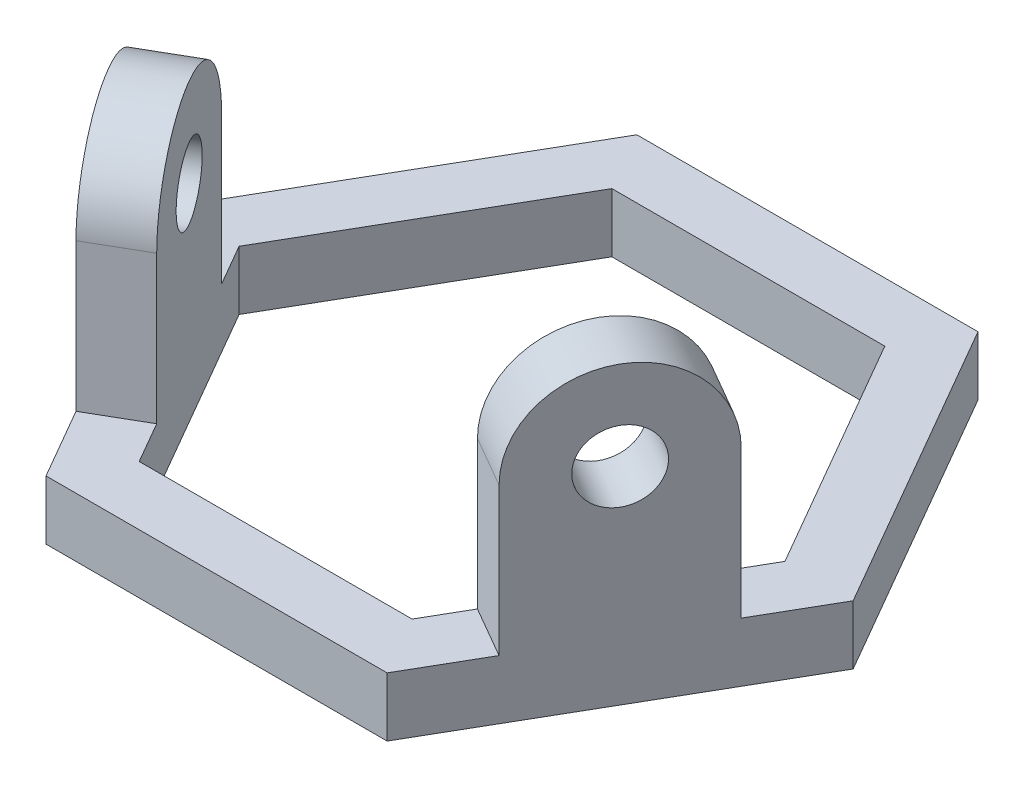
ISO-10303-21;
HEADER;
FILE_DESCRIPTION(('STEP AP214'),'2;1');
FILE_NAME('part.step','',(''),(''),'','','');
FILE_SCHEMA(('AUTOMOTIVE_DESIGN { 1 0 10303 214 1 1 1 1 }'));
ENDSEC;
DATA;
#1=APPLICATION_CONTEXT('core data for automotive mechanical design processes');
#2=APPLICATION_PROTOCOL_DEFINITION('international standard','automotive_design',2000,#1);
#3=PRODUCT_CONTEXT('',#1,'mechanical');
#4=PRODUCT('Part','Part','',(#3));
#5=PRODUCT_RELATED_PRODUCT_CATEGORY('part','',(#4));
#6=PRODUCT_DEFINITION_FORMATION('','',#4);
#7=PRODUCT_DEFINITION_CONTEXT('part definition',#1,'design');
#8=PRODUCT_DEFINITION('design','',#6,#7);
#9=PRODUCT_DEFINITION_SHAPE('','',#8);
#10=(LENGTH_UNIT() NAMED_UNIT(*) SI_UNIT(.MILLI.,.METRE.));
#11=(NAMED_UNIT(*) PLANE_ANGLE_UNIT() SI_UNIT($,.RADIAN.));
#12=(NAMED_UNIT(*) SI_UNIT($,.STERADIAN.) SOLID_ANGLE_UNIT());
#13=UNCERTAINTY_MEASURE_WITH_UNIT(LENGTH_MEASURE(1.E-05),#10,'distance_accuracy_value','');
#14=(GEOMETRIC_REPRESENTATION_CONTEXT(3) GLOBAL_UNCERTAINTY_ASSIGNED_CONTEXT((#13)) GLOBAL_UNIT_ASSIGNED_CONTEXT((#10,
#11,#12)) REPRESENTATION_CONTEXT('',''));
#15=CARTESIAN_POINT('',(0.,0.,0.));
#16=DIRECTION('',(0.,0.,1.));
#17=DIRECTION('',(1.,0.,0.));
#18=AXIS2_PLACEMENT_3D('',#15,#16,#17);
#19=CARTESIAN_POINT('',(0.,10.,0.));
#20=DIRECTION('',(0.,1.,0.));
#21=DIRECTION('',(0.,0.,1.));
#22=AXIS2_PLACEMENT_3D('',#19,#20,#21);
#23=PLANE('',#22);
#24=DIRECTION('',(0.5,0.,0.866025403784439));
#25=VECTOR('',#24,1.);
#26=CARTESIAN_POINT('',(-46.1880215351703,10.,0.));
#27=LINE('',#26,#25);
#28=CARTESIAN_POINT('',(-27.1410161513779,10.,32.9903810567665));
#29=VERTEX_POINT('',#28);
#30=CARTESIAN_POINT('',(-23.0940107675851,10.,40.0000000000003));
#31=VERTEX_POINT('',#30);
#32=EDGE_CURVE('E256',#29,#31,#27,.T.);
#33=ORIENTED_EDGE('',*,*,#32,.F.);
#34=DIRECTION('',(-0.866025403784442,0.,0.499999999999995));
#35=VECTOR('',#34,1.);
#36=CARTESIAN_POINT('',(-27.1410161513779,10.,32.9903810567665));
#37=LINE('',#36,#35);
#38=CARTESIAN_POINT('',(-35.801270189222,10.,37.9903810567663));
#39=VERTEX_POINT('',#38);
#40=EDGE_CURVE('E218',#29,#39,#37,.T.);
#41=ORIENTED_EDGE('',*,*,#40,.T.);
#42=DIRECTION('',(0.500000000000007,0.,0.866025403784434));
#43=VECTOR('',#42,1.);
#44=CARTESIAN_POINT('',(-57.7350269189626,10.,4.03161538170328E-13));
#45=LINE('',#44,#43);
#46=CARTESIAN_POINT('',(-28.8675134594808,10.,50.0000000000003));
#47=VERTEX_POINT('',#46);
#48=EDGE_CURVE('E306',#39,#47,#45,.T.);
#49=ORIENTED_EDGE('',*,*,#48,.T.);
#50=DIRECTION('',(1.,0.,0.));
#51=VECTOR('',#50,1.);
#52=CARTESIAN_POINT('',(-28.8675134594808,10.,50.0000000000003));
#53=LINE('',#52,#51);
#54=CARTESIAN_POINT('',(28.8675134594819,10.,49.9999999999997));
#55=VERTEX_POINT('',#54);
#56=EDGE_CURVE('E315',#47,#55,#53,.T.);
#57=ORIENTED_EDGE('',*,*,#56,.T.);
#58=DIRECTION('',(0.499999999999995,0.,-0.866025403784441));
#59=VECTOR('',#58,1.);
#60=CARTESIAN_POINT('',(28.8675134594819,10.,49.9999999999997));
#61=LINE('',#60,#59);
#62=CARTESIAN_POINT('',(35.8012701892223,10.,37.9903810567665));
#63=VERTEX_POINT('',#62);
#64=EDGE_CURVE('E297',#55,#63,#61,.T.);
#65=ORIENTED_EDGE('',*,*,#64,.T.);
#66=DIRECTION('',(0.866025403784442,0.,0.499999999999995));
#67=VECTOR('',#66,1.);
#68=CARTESIAN_POINT('',(27.1410161513779,10.,32.9903810567665));
#69=LINE('',#68,#67);
#70=CARTESIAN_POINT('',(27.1410161513779,10.,32.9903810567665));
#71=VERTEX_POINT('',#70);
#72=EDGE_CURVE('E248',#71,#63,#69,.T.);
#73=ORIENTED_EDGE('',*,*,#72,.F.);
#74=DIRECTION('',(0.5,0.,-0.866025403784439));
#75=VECTOR('',#74,1.);
#76=CARTESIAN_POINT('',(23.0940107675853,10.,40.0000000000003));
#77=LINE('',#76,#75);
#78=CARTESIAN_POINT('',(23.0940107675853,10.,40.0000000000003));
#79=VERTEX_POINT('',#78);
#80=EDGE_CURVE('E262',#79,#71,#77,.T.);
#81=ORIENTED_EDGE('',*,*,#80,.F.);
#82=DIRECTION('',(1.,0.,0.));
#83=VECTOR('',#82,1.);
#84=CARTESIAN_POINT('',(-23.0940107675851,10.,40.0000000000003));
#85=LINE('',#84,#83);
#86=EDGE_CURVE('E257',#31,#79,#85,.T.);
#87=ORIENTED_EDGE('',*,*,#86,.F.);
#88=EDGE_LOOP('',(#33,#41,#49,#57,#65,#73,#81,#87));
#89=FACE_BOUND('',#88,.T.);
#90=ADVANCED_FACE('F41',(#89),#23,.T.);
#91=DIRECTION('',(-0.866025403784442,0.,0.499999999999995));
#92=VECTOR('',#91,1.);
#93=CARTESIAN_POINT('',(-42.1410161513778,10.,7.00961894323329));
#94=LINE('',#93,#92);
#95=CARTESIAN_POINT('',(-42.1410161513778,10.,7.00961894323329));
#96=VERTEX_POINT('',#95);
#97=CARTESIAN_POINT('',(-50.8012701892222,10.,12.0096189432332));
#98=VERTEX_POINT('',#97);
#99=EDGE_CURVE('E205',#96,#98,#94,.T.);
#100=ORIENTED_EDGE('',*,*,#99,.F.);
#101=CARTESIAN_POINT('',(-46.1880215351703,10.,0.));
#102=VERTEX_POINT('',#101);
#103=EDGE_CURVE('E190',#102,#96,#27,.T.);
#104=ORIENTED_EDGE('',*,*,#103,.F.);
#105=DIRECTION('',(-0.5,0.,0.866025403784439));
#106=VECTOR('',#105,1.);
#107=CARTESIAN_POINT('',(-23.0940107675852,10.,-40.0000000000001));
#108=LINE('',#107,#106);
#109=CARTESIAN_POINT('',(-23.0940107675852,10.,-40.0000000000001));
#110=VERTEX_POINT('',#109);
#111=EDGE_CURVE('E258',#110,#102,#108,.T.);
#112=ORIENTED_EDGE('',*,*,#111,.F.);
#113=DIRECTION('',(-1.,0.,0.));
#114=VECTOR('',#113,1.);
#115=CARTESIAN_POINT('',(23.094010767585,10.,-40.0000000000001));
#116=LINE('',#115,#114);
#117=CARTESIAN_POINT('',(23.094010767585,10.,-40.0000000000001));
#118=VERTEX_POINT('',#117);
#119=EDGE_CURVE('E251',#118,#110,#116,.T.);
#120=ORIENTED_EDGE('',*,*,#119,.F.);
#121=DIRECTION('',(-0.5,0.,-0.866025403784439));
#122=VECTOR('',#121,1.);
#123=CARTESIAN_POINT('',(46.1880215351703,10.,3.32199545649559E-13));
#124=LINE('',#123,#122);
#125=CARTESIAN_POINT('',(46.1880215351703,10.,3.32199545649559E-13));
#126=VERTEX_POINT('',#125);
#127=EDGE_CURVE('E253',#126,#118,#124,.T.);
#128=ORIENTED_EDGE('',*,*,#127,.F.);
#129=CARTESIAN_POINT('',(42.1410161513778,10.,7.00961894323329));
#130=VERTEX_POINT('',#129);
#131=EDGE_CURVE('E263',#130,#126,#77,.T.);
#132=ORIENTED_EDGE('',*,*,#131,.F.);
#133=DIRECTION('',(0.866025403784442,0.,0.499999999999995));
#134=VECTOR('',#133,1.);
#135=CARTESIAN_POINT('',(42.1410161513778,10.,7.00961894323329));
#136=LINE('',#135,#134);
#137=CARTESIAN_POINT('',(50.8012701892222,10.,12.0096189432332));
#138=VERTEX_POINT('',#137);
#139=EDGE_CURVE('E246',#130,#138,#136,.T.);
#140=ORIENTED_EDGE('',*,*,#139,.T.);
#141=CARTESIAN_POINT('',(57.7350269189626,10.,0.));
#142=VERTEX_POINT('',#141);
#143=EDGE_CURVE('E305',#138,#142,#61,.T.);
#144=ORIENTED_EDGE('',*,*,#143,.T.);
#145=DIRECTION('',(-0.500000000000001,0.,-0.866025403784438));
#146=VECTOR('',#145,1.);
#147=CARTESIAN_POINT('',(57.7350269189626,10.,0.));
#148=LINE('',#147,#146);
#149=CARTESIAN_POINT('',(28.8675134594812,10.,-50.0000000000001));
#150=VERTEX_POINT('',#149);
#151=EDGE_CURVE('E301',#142,#150,#148,.T.);
#152=ORIENTED_EDGE('',*,*,#151,.T.);
#153=DIRECTION('',(-1.,0.,0.));
#154=VECTOR('',#153,1.);
#155=CARTESIAN_POINT('',(28.8675134594812,10.,-50.0000000000001));
#156=LINE('',#155,#154);
#157=CARTESIAN_POINT('',(-28.8675134594815,10.,-49.9999999999999));
#158=VERTEX_POINT('',#157);
#159=EDGE_CURVE('E302',#150,#158,#156,.T.);
#160=ORIENTED_EDGE('',*,*,#159,.T.);
#161=DIRECTION('',(-0.499999999999995,0.,0.866025403784442));
#162=VECTOR('',#161,1.);
#163=CARTESIAN_POINT('',(-28.8675134594815,10.,-49.9999999999999));
#164=LINE('',#163,#162);
#165=CARTESIAN_POINT('',(-57.7350269189626,10.,4.03161538170328E-13));
#166=VERTEX_POINT('',#165);
#167=EDGE_CURVE('E308',#158,#166,#164,.T.);
#168=ORIENTED_EDGE('',*,*,#167,.T.);
#169=EDGE_CURVE('E310',#166,#98,#45,.T.);
#170=ORIENTED_EDGE('',*,*,#169,.T.);
#171=EDGE_LOOP('',(#100,#104,#112,#120,#128,#132,#140,#144,#152,#160,#168,#170));
#172=FACE_BOUND('',#171,.T.);
#173=ADVANCED_FACE('F361',(#172),#23,.T.);
#174=CARTESIAN_POINT('',(0.,0.,0.));
#175=DIRECTION('',(0.,1.,0.));
#176=DIRECTION('',(0.,0.,1.));
#177=AXIS2_PLACEMENT_3D('',#174,#175,#176);
#178=PLANE('',#177);
#179=DIRECTION('',(0.499999999999995,0.,-0.866025403784441));
#180=VECTOR('',#179,1.);
#181=CARTESIAN_POINT('',(28.8675134594819,0.,49.9999999999997));
#182=LINE('',#181,#180);
#183=CARTESIAN_POINT('',(28.8675134594819,0.,49.9999999999997));
#184=VERTEX_POINT('',#183);
#185=CARTESIAN_POINT('',(57.7350269189626,0.,0.));
#186=VERTEX_POINT('',#185);
#187=EDGE_CURVE('E299',#184,#186,#182,.T.);
#188=ORIENTED_EDGE('',*,*,#187,.F.);
#189=DIRECTION('',(1.,0.,0.));
#190=VECTOR('',#189,1.);
#191=CARTESIAN_POINT('',(-28.8675134594808,0.,50.0000000000003));
#192=LINE('',#191,#190);
#193=CARTESIAN_POINT('',(-28.8675134594808,0.,50.0000000000003));
#194=VERTEX_POINT('',#193);
#195=EDGE_CURVE('E324',#194,#184,#192,.T.);
#196=ORIENTED_EDGE('',*,*,#195,.F.);
#197=DIRECTION('',(0.500000000000007,0.,0.866025403784434));
#198=VECTOR('',#197,1.);
#199=CARTESIAN_POINT('',(-57.7350269189626,0.,4.03161538170328E-13));
#200=LINE('',#199,#198);
#201=CARTESIAN_POINT('',(-57.7350269189626,0.,4.03161538170328E-13));
#202=VERTEX_POINT('',#201);
#203=EDGE_CURVE('E323',#202,#194,#200,.T.);
#204=ORIENTED_EDGE('',*,*,#203,.F.);
#205=DIRECTION('',(-0.499999999999995,0.,0.866025403784442));
#206=VECTOR('',#205,1.);
#207=CARTESIAN_POINT('',(-28.8675134594815,0.,-49.9999999999999));
#208=LINE('',#207,#206);
#209=CARTESIAN_POINT('',(-28.8675134594815,0.,-49.9999999999999));
#210=VERTEX_POINT('',#209);
#211=EDGE_CURVE('E321',#210,#202,#208,.T.);
#212=ORIENTED_EDGE('',*,*,#211,.F.);
#213=DIRECTION('',(-1.,0.,0.));
#214=VECTOR('',#213,1.);
#215=CARTESIAN_POINT('',(28.8675134594812,0.,-50.0000000000001));
#216=LINE('',#215,#214);
#217=CARTESIAN_POINT('',(28.8675134594812,0.,-50.0000000000001));
#218=VERTEX_POINT('',#217);
#219=EDGE_CURVE('E317',#218,#210,#216,.T.);
#220=ORIENTED_EDGE('',*,*,#219,.F.);
#221=DIRECTION('',(-0.500000000000001,0.,-0.866025403784438));
#222=VECTOR('',#221,1.);
#223=CARTESIAN_POINT('',(57.7350269189626,0.,0.));
#224=LINE('',#223,#222);
#225=EDGE_CURVE('E320',#186,#218,#224,.T.);
#226=ORIENTED_EDGE('',*,*,#225,.F.);
#227=EDGE_LOOP('',(#188,#196,#204,#212,#220,#226));
#228=FACE_BOUND('',#227,.T.);
#229=DIRECTION('',(-0.5,0.,-0.866025403784439));
#230=VECTOR('',#229,1.);
#231=CARTESIAN_POINT('',(46.1880215351703,0.,3.32199545649559E-13));
#232=LINE('',#231,#230);
#233=CARTESIAN_POINT('',(46.1880215351703,0.,3.33066907387547E-13));
#234=VERTEX_POINT('',#233);
#235=CARTESIAN_POINT('',(23.094010767585,0.,-40.0000000000001));
#236=VERTEX_POINT('',#235);
#237=EDGE_CURVE('E241',#234,#236,#232,.T.);
#238=ORIENTED_EDGE('',*,*,#237,.T.);
#239=DIRECTION('',(-1.,0.,0.));
#240=VECTOR('',#239,1.);
#241=CARTESIAN_POINT('',(23.094010767585,0.,-40.0000000000001));
#242=LINE('',#241,#240);
#243=CARTESIAN_POINT('',(-23.0940107675852,0.,-40.0000000000001));
#244=VERTEX_POINT('',#243);
#245=EDGE_CURVE('E269',#236,#244,#242,.T.);
#246=ORIENTED_EDGE('',*,*,#245,.T.);
#247=DIRECTION('',(-0.5,0.,0.866025403784439));
#248=VECTOR('',#247,1.);
#249=CARTESIAN_POINT('',(-23.0940107675852,0.,-40.0000000000001));
#250=LINE('',#249,#248);
#251=CARTESIAN_POINT('',(-46.1880215351703,0.,0.));
#252=VERTEX_POINT('',#251);
#253=EDGE_CURVE('E272',#244,#252,#250,.T.);
#254=ORIENTED_EDGE('',*,*,#253,.T.);
#255=DIRECTION('',(0.5,0.,0.866025403784439));
#256=VECTOR('',#255,1.);
#257=CARTESIAN_POINT('',(-46.1880215351703,0.,0.));
#258=LINE('',#257,#256);
#259=CARTESIAN_POINT('',(-23.0940107675851,0.,40.0000000000003));
#260=VERTEX_POINT('',#259);
#261=EDGE_CURVE('E277',#252,#260,#258,.T.);
#262=ORIENTED_EDGE('',*,*,#261,.T.);
#263=DIRECTION('',(1.,0.,0.));
#264=VECTOR('',#263,1.);
#265=CARTESIAN_POINT('',(-23.0940107675851,0.,40.0000000000003));
#266=LINE('',#265,#264);
#267=CARTESIAN_POINT('',(23.0940107675853,0.,40.0000000000003));
#268=VERTEX_POINT('',#267);
#269=EDGE_CURVE('E276',#260,#268,#266,.T.);
#270=ORIENTED_EDGE('',*,*,#269,.T.);
#271=DIRECTION('',(0.5,0.,-0.866025403784439));
#272=VECTOR('',#271,1.);
#273=CARTESIAN_POINT('',(23.0940107675853,0.,40.0000000000003));
#274=LINE('',#273,#272);
#275=EDGE_CURVE('E255',#268,#234,#274,.T.);
#276=ORIENTED_EDGE('',*,*,#275,.T.);
#277=EDGE_LOOP('',(#238,#246,#254,#262,#270,#276));
#278=FACE_BOUND('',#277,.T.);
#279=ADVANCED_FACE('F349',(#228,#278),#178,.F.);
#280=CARTESIAN_POINT('',(28.8675134594819,10.,49.9999999999997));
#281=DIRECTION('',(-0.866025403784441,0.,-0.499999999999995));
#282=DIRECTION('',(-0.499999999999995,0.,0.866025403784441));
#283=AXIS2_PLACEMENT_3D('',#280,#281,#282);
#284=PLANE('',#283);
#285=ORIENTED_EDGE('',*,*,#187,.T.);
#286=DIRECTION('',(0.,-1.,0.));
#287=VECTOR('',#286,1.);
#288=CARTESIAN_POINT('',(57.7350269189626,10.,0.));
#289=LINE('',#288,#287);
#290=EDGE_CURVE('E11',#142,#186,#289,.T.);
#291=ORIENTED_EDGE('',*,*,#290,.F.);
#292=ORIENTED_EDGE('',*,*,#143,.F.);
#293=DIRECTION('',(0.,1.,0.));
#294=VECTOR('',#293,1.);
#295=CARTESIAN_POINT('',(50.8012701892222,35.,12.0096189432332));
#296=LINE('',#295,#294);
#297=CARTESIAN_POINT('',(50.8012701892222,35.,12.0096189432332));
#298=VERTEX_POINT('',#297);
#299=EDGE_CURVE('E65',#138,#298,#296,.T.);
#300=ORIENTED_EDGE('',*,*,#299,.T.);
#301=CARTESIAN_POINT('',(43.3012701892223,35.,24.9999999999999));
#302=DIRECTION('',(0.866025403784442,0.,0.499999999999995));
#303=DIRECTION('',(0.499999999999995,0.,-0.866025403784442));
#304=AXIS2_PLACEMENT_3D('',#301,#302,#303);
#305=CIRCLE('',#304,15.);
#306=CARTESIAN_POINT('',(35.8012701892223,35.,37.9903810567665));
#307=VERTEX_POINT('',#306);
#308=EDGE_CURVE('E223',#298,#307,#305,.T.);
#309=ORIENTED_EDGE('',*,*,#308,.T.);
#310=DIRECTION('',(0.,-1.,0.));
#311=VECTOR('',#310,1.);
#312=CARTESIAN_POINT('',(35.8012701892223,35.,37.9903810567665));
#313=LINE('',#312,#311);
#314=EDGE_CURVE('E239',#307,#63,#313,.T.);
#315=ORIENTED_EDGE('',*,*,#314,.T.);
#316=ORIENTED_EDGE('',*,*,#64,.F.);
#317=DIRECTION('',(0.,-1.,0.));
#318=VECTOR('',#317,1.);
#319=CARTESIAN_POINT('',(28.8675134594819,10.,49.9999999999997));
#320=LINE('',#319,#318);
#321=EDGE_CURVE('E314',#55,#184,#320,.T.);
#322=ORIENTED_EDGE('',*,*,#321,.T.);
#323=EDGE_LOOP('',(#285,#291,#292,#300,#309,#315,#316,#322));
#324=FACE_BOUND('',#323,.T.);
#325=CARTESIAN_POINT('',(43.3012701892223,35.,24.9999999999999));
#326=DIRECTION('',(0.866025403784442,0.,0.499999999999995));
#327=DIRECTION('',(0.499999999999995,0.,-0.866025403784442));
#328=AXIS2_PLACEMENT_3D('',#325,#326,#327);
#329=CIRCLE('',#328,6.);
#330=CARTESIAN_POINT('',(46.3012701892222,35.,19.8038475772932));
#331=VERTEX_POINT('',#330);
#332=EDGE_CURVE('E217',#331,#331,#329,.T.);
#333=ORIENTED_EDGE('',*,*,#332,.F.);
#334=EDGE_LOOP('',(#333));
#335=FACE_BOUND('',#334,.T.);
#336=ADVANCED_FACE('F43',(#324,#335),#284,.F.);
#337=CARTESIAN_POINT('',(57.7350269189626,10.,0.));
#338=DIRECTION('',(-0.866025403784438,0.,0.500000000000001));
#339=DIRECTION('',(0.500000000000001,0.,0.866025403784438));
#340=AXIS2_PLACEMENT_3D('',#337,#338,#339);
#341=PLANE('',#340);
#342=ORIENTED_EDGE('',*,*,#225,.T.);
#343=DIRECTION('',(0.,-1.,0.));
#344=VECTOR('',#343,1.);
#345=CARTESIAN_POINT('',(28.8675134594812,10.,-50.0000000000001));
#346=LINE('',#345,#344);
#347=EDGE_CURVE('E47',#150,#218,#346,.T.);
#348=ORIENTED_EDGE('',*,*,#347,.F.);
#349=ORIENTED_EDGE('',*,*,#151,.F.);
#350=ORIENTED_EDGE('',*,*,#290,.T.);
#351=EDGE_LOOP('',(#342,#348,#349,#350));
#352=FACE_BOUND('',#351,.T.);
#353=ADVANCED_FACE('F368',(#352),#341,.F.);
#354=CARTESIAN_POINT('',(28.8675134594812,10.,-50.0000000000001));
#355=DIRECTION('',(0.,0.,1.));
#356=DIRECTION('',(1.,0.,0.));
#357=AXIS2_PLACEMENT_3D('',#354,#355,#356);
#358=PLANE('',#357);
#359=ORIENTED_EDGE('',*,*,#219,.T.);
#360=DIRECTION('',(0.,-1.,0.));
#361=VECTOR('',#360,1.);
#362=CARTESIAN_POINT('',(-28.8675134594815,10.,-49.9999999999999));
#363=LINE('',#362,#361);
#364=EDGE_CURVE('E333',#158,#210,#363,.T.);
#365=ORIENTED_EDGE('',*,*,#364,.F.);
#366=ORIENTED_EDGE('',*,*,#159,.F.);
#367=ORIENTED_EDGE('',*,*,#347,.T.);
#368=EDGE_LOOP('',(#359,#365,#366,#367));
#369=FACE_BOUND('',#368,.T.);
#370=ADVANCED_FACE('F345',(#369),#358,.F.);
#371=CARTESIAN_POINT('',(-28.8675134594815,10.,-49.9999999999999));
#372=DIRECTION('',(0.866025403784442,0.,0.499999999999995));
#373=DIRECTION('',(0.499999999999995,0.,-0.866025403784442));
#374=AXIS2_PLACEMENT_3D('',#371,#372,#373);
#375=PLANE('',#374);
#376=ORIENTED_EDGE('',*,*,#211,.T.);
#377=DIRECTION('',(0.,-1.,0.));
#378=VECTOR('',#377,1.);
#379=CARTESIAN_POINT('',(-57.7350269189626,10.,4.03161538170328E-13));
#380=LINE('',#379,#378);
#381=EDGE_CURVE('E335',#166,#202,#380,.T.);
#382=ORIENTED_EDGE('',*,*,#381,.F.);
#383=ORIENTED_EDGE('',*,*,#167,.F.);
#384=ORIENTED_EDGE('',*,*,#364,.T.);
#385=EDGE_LOOP('',(#376,#382,#383,#384));
#386=FACE_BOUND('',#385,.T.);
#387=ADVANCED_FACE('F351',(#386),#375,.F.);
#388=CARTESIAN_POINT('',(-57.7350269189626,10.,4.03161538170328E-13));
#389=DIRECTION('',(0.866025403784435,0.,-0.500000000000007));
#390=DIRECTION('',(-0.500000000000007,0.,-0.866025403784435));
#391=AXIS2_PLACEMENT_3D('',#388,#389,#390);
#392=PLANE('',#391);
#393=ORIENTED_EDGE('',*,*,#203,.T.);
#394=DIRECTION('',(0.,-1.,0.));
#395=VECTOR('',#394,1.);
#396=CARTESIAN_POINT('',(-28.8675134594808,10.,50.0000000000003));
#397=LINE('',#396,#395);
#398=EDGE_CURVE('E328',#47,#194,#397,.T.);
#399=ORIENTED_EDGE('',*,*,#398,.F.);
#400=ORIENTED_EDGE('',*,*,#48,.F.);
#401=DIRECTION('',(0.,-1.,0.));
#402=VECTOR('',#401,1.);
#403=CARTESIAN_POINT('',(-35.8012701892223,35.,37.9903810567665));
#404=LINE('',#403,#402);
#405=CARTESIAN_POINT('',(-35.8012701892223,35.,37.9903810567665));
#406=VERTEX_POINT('',#405);
#407=EDGE_CURVE('E57',#406,#39,#404,.T.);
#408=ORIENTED_EDGE('',*,*,#407,.F.);
#409=CARTESIAN_POINT('',(-43.3012701892223,35.,24.9999999999999));
#410=DIRECTION('',(0.866025403784442,0.,-0.499999999999995));
#411=DIRECTION('',(-0.499999999999995,0.,-0.866025403784442));
#412=AXIS2_PLACEMENT_3D('',#409,#410,#411);
#413=CIRCLE('',#412,15.);
#414=CARTESIAN_POINT('',(-50.8012701892222,35.,12.0096189432332));
#415=VERTEX_POINT('',#414);
#416=EDGE_CURVE('E213',#415,#406,#413,.T.);
#417=ORIENTED_EDGE('',*,*,#416,.F.);
#418=DIRECTION('',(0.,1.,0.));
#419=VECTOR('',#418,1.);
#420=CARTESIAN_POINT('',(-50.8012701892222,35.,12.0096189432332));
#421=LINE('',#420,#419);
#422=EDGE_CURVE('E196',#98,#415,#421,.T.);
#423=ORIENTED_EDGE('',*,*,#422,.F.);
#424=ORIENTED_EDGE('',*,*,#169,.F.);
#425=ORIENTED_EDGE('',*,*,#381,.T.);
#426=EDGE_LOOP('',(#393,#399,#400,#408,#417,#423,#424,#425));
#427=FACE_BOUND('',#426,.T.);
#428=CARTESIAN_POINT('',(-43.3012701892223,35.,24.9999999999999));
#429=DIRECTION('',(0.866025403784442,0.,-0.499999999999995));
#430=DIRECTION('',(-0.499999999999995,0.,-0.866025403784442));
#431=AXIS2_PLACEMENT_3D('',#428,#429,#430);
#432=CIRCLE('',#431,6.);
#433=CARTESIAN_POINT('',(-46.3012701892222,35.,19.8038475772932));
#434=VERTEX_POINT('',#433);
#435=EDGE_CURVE('E207',#434,#434,#432,.T.);
#436=ORIENTED_EDGE('',*,*,#435,.T.);
#437=EDGE_LOOP('',(#436));
#438=FACE_BOUND('',#437,.T.);
#439=ADVANCED_FACE('F357',(#427,#438),#392,.F.);
#440=CARTESIAN_POINT('',(-28.8675134594808,10.,50.0000000000003));
#441=DIRECTION('',(0.,0.,-1.));
#442=DIRECTION('',(-1.,0.,0.));
#443=AXIS2_PLACEMENT_3D('',#440,#441,#442);
#444=PLANE('',#443);
#445=ORIENTED_EDGE('',*,*,#195,.T.);
#446=ORIENTED_EDGE('',*,*,#321,.F.);
#447=ORIENTED_EDGE('',*,*,#56,.F.);
#448=ORIENTED_EDGE('',*,*,#398,.T.);
#449=EDGE_LOOP('',(#445,#446,#447,#448));
#450=FACE_BOUND('',#449,.T.);
#451=ADVANCED_FACE('F375',(#450),#444,.F.);
#452=CARTESIAN_POINT('',(46.1880215351703,10.,3.32199545649559E-13));
#453=DIRECTION('',(-0.866025403784439,0.,0.5));
#454=DIRECTION('',(0.5,0.,0.866025403784439));
#455=AXIS2_PLACEMENT_3D('',#452,#453,#454);
#456=PLANE('',#455);
#457=ORIENTED_EDGE('',*,*,#237,.F.);
#458=DIRECTION('',(0.,-1.,0.));
#459=VECTOR('',#458,1.);
#460=CARTESIAN_POINT('',(46.1880215351703,10.,3.32199545649559E-13));
#461=LINE('',#460,#459);
#462=EDGE_CURVE('E270',#126,#234,#461,.T.);
#463=ORIENTED_EDGE('',*,*,#462,.F.);
#464=ORIENTED_EDGE('',*,*,#127,.T.);
#465=DIRECTION('',(0.,-1.,0.));
#466=VECTOR('',#465,1.);
#467=CARTESIAN_POINT('',(23.094010767585,10.,-40.0000000000001));
#468=LINE('',#467,#466);
#469=EDGE_CURVE('E294',#118,#236,#468,.T.);
#470=ORIENTED_EDGE('',*,*,#469,.T.);
#471=EDGE_LOOP('',(#457,#463,#464,#470));
#472=FACE_BOUND('',#471,.T.);
#473=ADVANCED_FACE('F401',(#472),#456,.T.);
#474=CARTESIAN_POINT('',(23.094010767585,10.,-40.0000000000001));
#475=DIRECTION('',(0.,0.,1.));
#476=DIRECTION('',(1.,0.,0.));
#477=AXIS2_PLACEMENT_3D('',#474,#475,#476);
#478=PLANE('',#477);
#479=ORIENTED_EDGE('',*,*,#245,.F.);
#480=ORIENTED_EDGE('',*,*,#469,.F.);
#481=ORIENTED_EDGE('',*,*,#119,.T.);
#482=DIRECTION('',(0.,-1.,0.));
#483=VECTOR('',#482,1.);
#484=CARTESIAN_POINT('',(-23.0940107675852,10.,-40.0000000000001));
#485=LINE('',#484,#483);
#486=EDGE_CURVE('E295',#110,#244,#485,.T.);
#487=ORIENTED_EDGE('',*,*,#486,.T.);
#488=EDGE_LOOP('',(#479,#480,#481,#487));
#489=FACE_BOUND('',#488,.T.);
#490=ADVANCED_FACE('F399',(#489),#478,.T.);
#491=CARTESIAN_POINT('',(-23.0940107675852,10.,-40.0000000000001));
#492=DIRECTION('',(0.866025403784439,0.,0.5));
#493=DIRECTION('',(0.5,0.,-0.866025403784439));
#494=AXIS2_PLACEMENT_3D('',#491,#492,#493);
#495=PLANE('',#494);
#496=ORIENTED_EDGE('',*,*,#253,.F.);
#497=ORIENTED_EDGE('',*,*,#486,.F.);
#498=ORIENTED_EDGE('',*,*,#111,.T.);
#499=DIRECTION('',(0.,-1.,0.));
#500=VECTOR('',#499,1.);
#501=CARTESIAN_POINT('',(-46.1880215351703,10.,0.));
#502=LINE('',#501,#500);
#503=EDGE_CURVE('E289',#102,#252,#502,.T.);
#504=ORIENTED_EDGE('',*,*,#503,.T.);
#505=EDGE_LOOP('',(#496,#497,#498,#504));
#506=FACE_BOUND('',#505,.T.);
#507=ADVANCED_FACE('F398',(#506),#495,.T.);
#508=CARTESIAN_POINT('',(-46.1880215351703,10.,0.));
#509=DIRECTION('',(0.866025403784439,0.,-0.5));
#510=DIRECTION('',(-0.5,0.,-0.866025403784439));
#511=AXIS2_PLACEMENT_3D('',#508,#509,#510);
#512=PLANE('',#511);
#513=ORIENTED_EDGE('',*,*,#261,.F.);
#514=ORIENTED_EDGE('',*,*,#503,.F.);
#515=ORIENTED_EDGE('',*,*,#103,.T.);
#516=DIRECTION('',(0.,1.,0.));
#517=VECTOR('',#516,1.);
#518=CARTESIAN_POINT('',(-42.1410161513778,35.,7.00961894323329));
#519=LINE('',#518,#517);
#520=CARTESIAN_POINT('',(-42.1410161513778,35.,7.00961894323329));
#521=VERTEX_POINT('',#520);
#522=EDGE_CURVE('E177',#96,#521,#519,.T.);
#523=ORIENTED_EDGE('',*,*,#522,.T.);
#524=CARTESIAN_POINT('',(-34.6410161513779,35.,19.9999999999999));
#525=DIRECTION('',(0.866025403784442,0.,-0.499999999999995));
#526=DIRECTION('',(-0.499999999999995,0.,-0.866025403784442));
#527=AXIS2_PLACEMENT_3D('',#524,#525,#526);
#528=CIRCLE('',#527,15.);
#529=CARTESIAN_POINT('',(-27.1410161513779,35.,32.9903810567665));
#530=VERTEX_POINT('',#529);
#531=EDGE_CURVE('E183',#521,#530,#528,.T.);
#532=ORIENTED_EDGE('',*,*,#531,.T.);
#533=DIRECTION('',(0.,-1.,0.));
#534=VECTOR('',#533,1.);
#535=CARTESIAN_POINT('',(-27.1410161513779,35.,32.9903810567665));
#536=LINE('',#535,#534);
#537=EDGE_CURVE('E195',#530,#29,#536,.T.);
#538=ORIENTED_EDGE('',*,*,#537,.T.);
#539=ORIENTED_EDGE('',*,*,#32,.T.);
#540=DIRECTION('',(0.,-1.,0.));
#541=VECTOR('',#540,1.);
#542=CARTESIAN_POINT('',(-23.0940107675851,10.,40.0000000000003));
#543=LINE('',#542,#541);
#544=EDGE_CURVE('E288',#31,#260,#543,.T.);
#545=ORIENTED_EDGE('',*,*,#544,.T.);
#546=EDGE_LOOP('',(#513,#514,#515,#523,#532,#538,#539,#545));
#547=FACE_BOUND('',#546,.T.);
#548=CARTESIAN_POINT('',(-34.6410161513779,35.,19.9999999999999));
#549=DIRECTION('',(0.866025403784442,0.,-0.499999999999995));
#550=DIRECTION('',(-0.499999999999995,0.,-0.866025403784442));
#551=AXIS2_PLACEMENT_3D('',#548,#549,#550);
#552=CIRCLE('',#551,6.);
#553=CARTESIAN_POINT('',(-37.6410161513778,35.,14.8038475772933));
#554=VERTEX_POINT('',#553);
#555=EDGE_CURVE('E214',#554,#554,#552,.T.);
#556=ORIENTED_EDGE('',*,*,#555,.F.);
#557=EDGE_LOOP('',(#556));
#558=FACE_BOUND('',#557,.T.);
#559=ADVANCED_FACE('F185',(#547,#558),#512,.T.);
#560=CARTESIAN_POINT('',(-23.0940107675851,10.,40.0000000000003));
#561=DIRECTION('',(0.,0.,-1.));
#562=DIRECTION('',(-1.,0.,0.));
#563=AXIS2_PLACEMENT_3D('',#560,#561,#562);
#564=PLANE('',#563);
#565=ORIENTED_EDGE('',*,*,#269,.F.);
#566=ORIENTED_EDGE('',*,*,#544,.F.);
#567=ORIENTED_EDGE('',*,*,#86,.T.);
#568=DIRECTION('',(0.,-1.,0.));
#569=VECTOR('',#568,1.);
#570=CARTESIAN_POINT('',(23.0940107675853,10.,40.0000000000003));
#571=LINE('',#570,#569);
#572=EDGE_CURVE('E286',#79,#268,#571,.T.);
#573=ORIENTED_EDGE('',*,*,#572,.T.);
#574=EDGE_LOOP('',(#565,#566,#567,#573));
#575=FACE_BOUND('',#574,.T.);
#576=ADVANCED_FACE('F385',(#575),#564,.T.);
#577=CARTESIAN_POINT('',(23.0940107675853,10.,40.0000000000003));
#578=DIRECTION('',(-0.866025403784439,0.,-0.5));
#579=DIRECTION('',(-0.5,0.,0.866025403784439));
#580=AXIS2_PLACEMENT_3D('',#577,#578,#579);
#581=PLANE('',#580);
#582=ORIENTED_EDGE('',*,*,#275,.F.);
#583=ORIENTED_EDGE('',*,*,#572,.F.);
#584=ORIENTED_EDGE('',*,*,#80,.T.);
#585=DIRECTION('',(0.,-1.,0.));
#586=VECTOR('',#585,1.);
#587=CARTESIAN_POINT('',(27.1410161513779,35.,32.9903810567665));
#588=LINE('',#587,#586);
#589=CARTESIAN_POINT('',(27.1410161513779,35.,32.9903810567665));
#590=VERTEX_POINT('',#589);
#591=EDGE_CURVE('E231',#590,#71,#588,.T.);
#592=ORIENTED_EDGE('',*,*,#591,.F.);
#593=CARTESIAN_POINT('',(34.6410161513779,35.,19.9999999999999));
#594=DIRECTION('',(0.866025403784442,0.,0.499999999999995));
#595=DIRECTION('',(0.499999999999995,0.,-0.866025403784442));
#596=AXIS2_PLACEMENT_3D('',#593,#594,#595);
#597=CIRCLE('',#596,15.);
#598=CARTESIAN_POINT('',(42.1410161513778,35.,7.00961894323329));
#599=VERTEX_POINT('',#598);
#600=EDGE_CURVE('E227',#599,#590,#597,.T.);
#601=ORIENTED_EDGE('',*,*,#600,.F.);
#602=DIRECTION('',(0.,1.,0.));
#603=VECTOR('',#602,1.);
#604=CARTESIAN_POINT('',(42.1410161513778,35.,7.00961894323329));
#605=LINE('',#604,#603);
#606=EDGE_CURVE('E233',#130,#599,#605,.T.);
#607=ORIENTED_EDGE('',*,*,#606,.F.);
#608=ORIENTED_EDGE('',*,*,#131,.T.);
#609=ORIENTED_EDGE('',*,*,#462,.T.);
#610=EDGE_LOOP('',(#582,#583,#584,#592,#601,#607,#608,#609));
#611=FACE_BOUND('',#610,.T.);
#612=CARTESIAN_POINT('',(34.6410161513779,35.,19.9999999999999));
#613=DIRECTION('',(0.866025403784442,0.,0.499999999999995));
#614=DIRECTION('',(0.499999999999995,0.,-0.866025403784442));
#615=AXIS2_PLACEMENT_3D('',#612,#613,#614);
#616=CIRCLE('',#615,6.);
#617=CARTESIAN_POINT('',(37.6410161513778,35.,14.8038475772933));
#618=VERTEX_POINT('',#617);
#619=EDGE_CURVE('E225',#618,#618,#616,.T.);
#620=ORIENTED_EDGE('',*,*,#619,.T.);
#621=EDGE_LOOP('',(#620));
#622=FACE_BOUND('',#621,.T.);
#623=ADVANCED_FACE('F389',(#611,#622),#581,.T.);
#624=CARTESIAN_POINT('',(34.6410161513779,35.,19.9999999999999));
#625=DIRECTION('',(0.866025403784442,0.,0.499999999999995));
#626=DIRECTION('',(0.499999999999995,0.,-0.866025403784442));
#627=AXIS2_PLACEMENT_3D('',#624,#625,#626);
#628=CYLINDRICAL_SURFACE('',#627,15.);
#629=ORIENTED_EDGE('',*,*,#308,.F.);
#630=DIRECTION('',(0.866025403784442,0.,0.499999999999995));
#631=VECTOR('',#630,1.);
#632=CARTESIAN_POINT('',(42.1410161513778,35.,7.00961894323329));
#633=LINE('',#632,#631);
#634=EDGE_CURVE('E242',#599,#298,#633,.T.);
#635=ORIENTED_EDGE('',*,*,#634,.F.);
#636=ORIENTED_EDGE('',*,*,#600,.T.);
#637=DIRECTION('',(0.866025403784442,0.,0.499999999999995));
#638=VECTOR('',#637,1.);
#639=CARTESIAN_POINT('',(27.1410161513779,35.,32.9903810567665));
#640=LINE('',#639,#638);
#641=EDGE_CURVE('E237',#590,#307,#640,.T.);
#642=ORIENTED_EDGE('',*,*,#641,.T.);
#643=EDGE_LOOP('',(#629,#635,#636,#642));
#644=FACE_BOUND('',#643,.T.);
#645=ADVANCED_FACE('F410',(#644),#628,.T.);
#646=CARTESIAN_POINT('',(42.1410161513778,35.,7.00961894323329));
#647=DIRECTION('',(0.499999999999995,0.,-0.866025403784442));
#648=DIRECTION('',(-0.866025403784442,0.,-0.499999999999995));
#649=AXIS2_PLACEMENT_3D('',#646,#647,#648);
#650=PLANE('',#649);
#651=ORIENTED_EDGE('',*,*,#299,.F.);
#652=ORIENTED_EDGE('',*,*,#139,.F.);
#653=ORIENTED_EDGE('',*,*,#606,.T.);
#654=ORIENTED_EDGE('',*,*,#634,.T.);
#655=EDGE_LOOP('',(#651,#652,#653,#654));
#656=FACE_BOUND('',#655,.T.);
#657=ADVANCED_FACE('F408',(#656),#650,.T.);
#658=CARTESIAN_POINT('',(27.1410161513779,35.,32.9903810567665));
#659=DIRECTION('',(-0.499999999999995,0.,0.866025403784442));
#660=DIRECTION('',(0.866025403784442,0.,0.499999999999995));
#661=AXIS2_PLACEMENT_3D('',#658,#659,#660);
#662=PLANE('',#661);
#663=ORIENTED_EDGE('',*,*,#314,.F.);
#664=ORIENTED_EDGE('',*,*,#641,.F.);
#665=ORIENTED_EDGE('',*,*,#591,.T.);
#666=ORIENTED_EDGE('',*,*,#72,.T.);
#667=EDGE_LOOP('',(#663,#664,#665,#666));
#668=FACE_BOUND('',#667,.T.);
#669=ADVANCED_FACE('F415',(#668),#662,.T.);
#670=CARTESIAN_POINT('',(34.6410161513779,35.,19.9999999999999));
#671=DIRECTION('',(0.866025403784442,0.,0.499999999999995));
#672=DIRECTION('',(0.499999999999995,0.,-0.866025403784442));
#673=AXIS2_PLACEMENT_3D('',#670,#671,#672);
#674=CYLINDRICAL_SURFACE('',#673,6.);
#675=ORIENTED_EDGE('',*,*,#619,.F.);
#676=EDGE_LOOP('',(#675));
#677=FACE_BOUND('',#676,.T.);
#678=ORIENTED_EDGE('',*,*,#332,.T.);
#679=EDGE_LOOP('',(#678));
#680=FACE_BOUND('',#679,.T.);
#681=ADVANCED_FACE('F412',(#677,#680),#674,.F.);
#682=CARTESIAN_POINT('',(-34.6410161513779,35.,19.9999999999999));
#683=DIRECTION('',(-0.866025403784442,0.,0.499999999999995));
#684=DIRECTION('',(0.499999999999995,0.,0.866025403784442));
#685=AXIS2_PLACEMENT_3D('',#682,#683,#684);
#686=CYLINDRICAL_SURFACE('',#685,15.);
#687=ORIENTED_EDGE('',*,*,#416,.T.);
#688=DIRECTION('',(-0.866025403784442,0.,0.499999999999995));
#689=VECTOR('',#688,1.);
#690=CARTESIAN_POINT('',(-27.1410161513779,35.,32.9903810567665));
#691=LINE('',#690,#689);
#692=EDGE_CURVE('E202',#530,#406,#691,.T.);
#693=ORIENTED_EDGE('',*,*,#692,.F.);
#694=ORIENTED_EDGE('',*,*,#531,.F.);
#695=DIRECTION('',(-0.866025403784442,0.,0.499999999999995));
#696=VECTOR('',#695,1.);
#697=CARTESIAN_POINT('',(-42.1410161513778,35.,7.00961894323329));
#698=LINE('',#697,#696);
#699=EDGE_CURVE('E194',#521,#415,#698,.T.);
#700=ORIENTED_EDGE('',*,*,#699,.T.);
#701=EDGE_LOOP('',(#687,#693,#694,#700));
#702=FACE_BOUND('',#701,.T.);
#703=ADVANCED_FACE('F204',(#702),#686,.T.);
#704=CARTESIAN_POINT('',(-27.1410161513779,35.,32.9903810567665));
#705=DIRECTION('',(-0.499999999999995,0.,-0.866025403784442));
#706=DIRECTION('',(-0.866025403784442,0.,0.499999999999995));
#707=AXIS2_PLACEMENT_3D('',#704,#705,#706);
#708=PLANE('',#707);
#709=ORIENTED_EDGE('',*,*,#407,.T.);
#710=ORIENTED_EDGE('',*,*,#40,.F.);
#711=ORIENTED_EDGE('',*,*,#537,.F.);
#712=ORIENTED_EDGE('',*,*,#692,.T.);
#713=EDGE_LOOP('',(#709,#710,#711,#712));
#714=FACE_BOUND('',#713,.T.);
#715=ADVANCED_FACE('F378',(#714),#708,.F.);
#716=CARTESIAN_POINT('',(-42.1410161513778,35.,7.00961894323329));
#717=DIRECTION('',(0.499999999999995,0.,0.866025403784442));
#718=DIRECTION('',(0.866025403784442,0.,-0.499999999999995));
#719=AXIS2_PLACEMENT_3D('',#716,#717,#718);
#720=PLANE('',#719);
#721=ORIENTED_EDGE('',*,*,#422,.T.);
#722=ORIENTED_EDGE('',*,*,#699,.F.);
#723=ORIENTED_EDGE('',*,*,#522,.F.);
#724=ORIENTED_EDGE('',*,*,#99,.T.);
#725=EDGE_LOOP('',(#721,#722,#723,#724));
#726=FACE_BOUND('',#725,.T.);
#727=ADVANCED_FACE('F198',(#726),#720,.F.);
#728=CARTESIAN_POINT('',(-34.6410161513779,35.,19.9999999999999));
#729=DIRECTION('',(-0.866025403784442,0.,0.499999999999995));
#730=DIRECTION('',(0.499999999999995,0.,0.866025403784442));
#731=AXIS2_PLACEMENT_3D('',#728,#729,#730);
#732=CYLINDRICAL_SURFACE('',#731,6.);
#733=ORIENTED_EDGE('',*,*,#555,.T.);
#734=EDGE_LOOP('',(#733));
#735=FACE_BOUND('',#734,.T.);
#736=ORIENTED_EDGE('',*,*,#435,.F.);
#737=EDGE_LOOP('',(#736));
#738=FACE_BOUND('',#737,.T.);
#739=ADVANCED_FACE('F529',(#735,#738),#732,.F.);
#740=CLOSED_SHELL('',(#90,#173,#279,#336,#353,#370,#387,#439,#451,#473,#490,#507,#559,#576,#623,
#645,#657,#669,#681,#703,#715,#727,#739));
#741=MANIFOLD_SOLID_BREP('B2',#740);
#742=ADVANCED_BREP_SHAPE_REPRESENTATION('',(#18,#741),#14);
#743=SHAPE_DEFINITION_REPRESENTATION(#9,#742);
ENDSEC;
END-ISO-10303-21;
